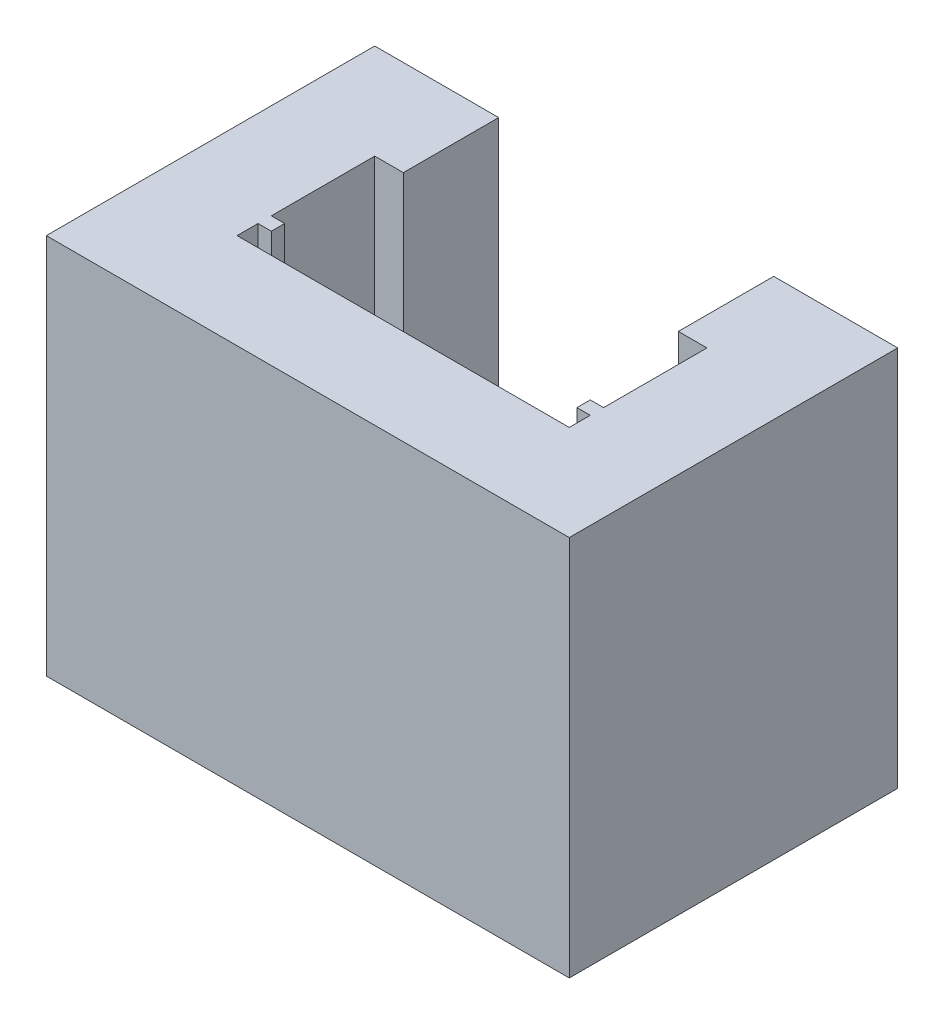
ISO-10303-21;
HEADER;
FILE_DESCRIPTION(('STEP AP214'),'2;1');
FILE_NAME('part.step','',(''),(''),'','','');
FILE_SCHEMA(('AUTOMOTIVE_DESIGN { 1 0 10303 214 1 1 1 1 }'));
ENDSEC;
DATA;
#1=APPLICATION_CONTEXT('core data for automotive mechanical design processes');
#2=APPLICATION_PROTOCOL_DEFINITION('international standard','automotive_design',2000,#1);
#3=PRODUCT_CONTEXT('',#1,'mechanical');
#4=PRODUCT('Part','Part','',(#3));
#5=PRODUCT_RELATED_PRODUCT_CATEGORY('part','',(#4));
#6=PRODUCT_DEFINITION_FORMATION('','',#4);
#7=PRODUCT_DEFINITION_CONTEXT('part definition',#1,'design');
#8=PRODUCT_DEFINITION('design','',#6,#7);
#9=PRODUCT_DEFINITION_SHAPE('','',#8);
#10=(LENGTH_UNIT() NAMED_UNIT(*) SI_UNIT(.MILLI.,.METRE.));
#11=(NAMED_UNIT(*) PLANE_ANGLE_UNIT() SI_UNIT($,.RADIAN.));
#12=(NAMED_UNIT(*) SI_UNIT($,.STERADIAN.) SOLID_ANGLE_UNIT());
#13=UNCERTAINTY_MEASURE_WITH_UNIT(LENGTH_MEASURE(1.E-05),#10,'distance_accuracy_value','');
#14=(GEOMETRIC_REPRESENTATION_CONTEXT(3) GLOBAL_UNCERTAINTY_ASSIGNED_CONTEXT((#13)) GLOBAL_UNIT_ASSIGNED_CONTEXT((#10,
#11,#12)) REPRESENTATION_CONTEXT('',''));
#15=CARTESIAN_POINT('',(0.,0.,0.));
#16=DIRECTION('',(0.,0.,1.));
#17=DIRECTION('',(1.,0.,0.));
#18=AXIS2_PLACEMENT_3D('',#15,#16,#17);
#19=CARTESIAN_POINT('',(8.71,20.,0.));
#20=DIRECTION('',(1.,0.,0.));
#21=DIRECTION('',(0.,0.,-1.));
#22=AXIS2_PLACEMENT_3D('',#19,#20,#21);
#23=PLANE('',#22);
#24=DIRECTION('',(0.,0.,1.));
#25=VECTOR('',#24,1.);
#26=CARTESIAN_POINT('',(8.71,0.,0.));
#27=LINE('',#26,#25);
#28=CARTESIAN_POINT('',(8.71,0.,-1.1));
#29=VERTEX_POINT('',#28);
#30=CARTESIAN_POINT('',(8.71,0.,0.));
#31=VERTEX_POINT('',#30);
#32=EDGE_CURVE('E218',#29,#31,#27,.T.);
#33=ORIENTED_EDGE('',*,*,#32,.T.);
#34=DIRECTION('',(0.,-1.,0.));
#35=VECTOR('',#34,1.);
#36=CARTESIAN_POINT('',(8.71,20.,0.));
#37=LINE('',#36,#35);
#38=CARTESIAN_POINT('',(8.71,20.,0.));
#39=VERTEX_POINT('',#38);
#40=EDGE_CURVE('E11',#39,#31,#37,.T.);
#41=ORIENTED_EDGE('',*,*,#40,.F.);
#42=DIRECTION('',(0.,0.,1.));
#43=VECTOR('',#42,1.);
#44=CARTESIAN_POINT('',(8.71,20.,0.));
#45=LINE('',#44,#43);
#46=CARTESIAN_POINT('',(8.71,20.,-1.1));
#47=VERTEX_POINT('',#46);
#48=EDGE_CURVE('E276',#47,#39,#45,.T.);
#49=ORIENTED_EDGE('',*,*,#48,.F.);
#50=DIRECTION('',(0.,-1.,0.));
#51=VECTOR('',#50,1.);
#52=CARTESIAN_POINT('',(8.71,20.,-1.1));
#53=LINE('',#52,#51);
#54=EDGE_CURVE('E214',#47,#29,#53,.T.);
#55=ORIENTED_EDGE('',*,*,#54,.T.);
#56=EDGE_LOOP('',(#33,#41,#49,#55));
#57=FACE_BOUND('',#56,.T.);
#58=ADVANCED_FACE('F45',(#57),#23,.F.);
#59=CARTESIAN_POINT('',(-8.71,20.,0.));
#60=DIRECTION('',(0.,0.,1.));
#61=DIRECTION('',(1.,0.,0.));
#62=AXIS2_PLACEMENT_3D('',#59,#60,#61);
#63=PLANE('',#62);
#64=DIRECTION('',(-1.,0.,0.));
#65=VECTOR('',#64,1.);
#66=CARTESIAN_POINT('',(-8.71,0.,0.));
#67=LINE('',#66,#65);
#68=CARTESIAN_POINT('',(-8.71,0.,0.));
#69=VERTEX_POINT('',#68);
#70=EDGE_CURVE('E222',#31,#69,#67,.T.);
#71=ORIENTED_EDGE('',*,*,#70,.T.);
#72=DIRECTION('',(0.,-1.,0.));
#73=VECTOR('',#72,1.);
#74=CARTESIAN_POINT('',(-8.71,20.,0.));
#75=LINE('',#74,#73);
#76=CARTESIAN_POINT('',(-8.71,20.,0.));
#77=VERTEX_POINT('',#76);
#78=EDGE_CURVE('E54',#77,#69,#75,.T.);
#79=ORIENTED_EDGE('',*,*,#78,.F.);
#80=DIRECTION('',(-1.,0.,0.));
#81=VECTOR('',#80,1.);
#82=CARTESIAN_POINT('',(-8.71,20.,0.));
#83=LINE('',#82,#81);
#84=EDGE_CURVE('E141',#39,#77,#83,.T.);
#85=ORIENTED_EDGE('',*,*,#84,.F.);
#86=ORIENTED_EDGE('',*,*,#40,.T.);
#87=EDGE_LOOP('',(#71,#79,#85,#86));
#88=FACE_BOUND('',#87,.T.);
#89=ADVANCED_FACE('F426',(#88),#63,.F.);
#90=CARTESIAN_POINT('',(-8.71,20.,0.));
#91=DIRECTION('',(-1.,0.,0.));
#92=DIRECTION('',(0.,0.,1.));
#93=AXIS2_PLACEMENT_3D('',#90,#91,#92);
#94=PLANE('',#93);
#95=DIRECTION('',(0.,0.,-1.));
#96=VECTOR('',#95,1.);
#97=CARTESIAN_POINT('',(-8.71,0.,0.));
#98=LINE('',#97,#96);
#99=CARTESIAN_POINT('',(-8.71,0.,-1.1));
#100=VERTEX_POINT('',#99);
#101=EDGE_CURVE('E225',#69,#100,#98,.T.);
#102=ORIENTED_EDGE('',*,*,#101,.T.);
#103=DIRECTION('',(0.,-1.,0.));
#104=VECTOR('',#103,1.);
#105=CARTESIAN_POINT('',(-8.71,20.,-1.1));
#106=LINE('',#105,#104);
#107=CARTESIAN_POINT('',(-8.71,20.,-1.1));
#108=VERTEX_POINT('',#107);
#109=EDGE_CURVE('E335',#108,#100,#106,.T.);
#110=ORIENTED_EDGE('',*,*,#109,.F.);
#111=DIRECTION('',(0.,0.,-1.));
#112=VECTOR('',#111,1.);
#113=CARTESIAN_POINT('',(-8.71,20.,0.));
#114=LINE('',#113,#112);
#115=EDGE_CURVE('E345',#77,#108,#114,.T.);
#116=ORIENTED_EDGE('',*,*,#115,.F.);
#117=ORIENTED_EDGE('',*,*,#78,.T.);
#118=EDGE_LOOP('',(#102,#110,#116,#117));
#119=FACE_BOUND('',#118,.T.);
#120=ADVANCED_FACE('F343',(#119),#94,.F.);
#121=CARTESIAN_POINT('',(-8.71,20.,-1.1));
#122=DIRECTION('',(0.,0.,-1.));
#123=DIRECTION('',(-1.,0.,0.));
#124=AXIS2_PLACEMENT_3D('',#121,#122,#123);
#125=PLANE('',#124);
#126=DIRECTION('',(1.,0.,0.));
#127=VECTOR('',#126,1.);
#128=CARTESIAN_POINT('',(-8.71,0.,-1.1));
#129=LINE('',#128,#127);
#130=CARTESIAN_POINT('',(-8.01,0.,-1.1));
#131=VERTEX_POINT('',#130);
#132=EDGE_CURVE('E228',#100,#131,#129,.T.);
#133=ORIENTED_EDGE('',*,*,#132,.T.);
#134=DIRECTION('',(0.,-1.,0.));
#135=VECTOR('',#134,1.);
#136=CARTESIAN_POINT('',(-8.01,20.,-1.1));
#137=LINE('',#136,#135);
#138=CARTESIAN_POINT('',(-8.01,20.,-1.1));
#139=VERTEX_POINT('',#138);
#140=EDGE_CURVE('E331',#139,#131,#137,.T.);
#141=ORIENTED_EDGE('',*,*,#140,.F.);
#142=DIRECTION('',(1.,0.,0.));
#143=VECTOR('',#142,1.);
#144=CARTESIAN_POINT('',(-8.71,20.,-1.1));
#145=LINE('',#144,#143);
#146=EDGE_CURVE('E364',#108,#139,#145,.T.);
#147=ORIENTED_EDGE('',*,*,#146,.F.);
#148=ORIENTED_EDGE('',*,*,#109,.T.);
#149=EDGE_LOOP('',(#133,#141,#147,#148));
#150=FACE_BOUND('',#149,.T.);
#151=ADVANCED_FACE('F354',(#150),#125,.F.);
#152=CARTESIAN_POINT('',(-8.01,20.,-1.1));
#153=DIRECTION('',(-1.,0.,0.));
#154=DIRECTION('',(0.,0.,1.));
#155=AXIS2_PLACEMENT_3D('',#152,#153,#154);
#156=PLANE('',#155);
#157=DIRECTION('',(0.,0.,-1.));
#158=VECTOR('',#157,1.);
#159=CARTESIAN_POINT('',(-8.01,0.,-1.1));
#160=LINE('',#159,#158);
#161=CARTESIAN_POINT('',(-8.01,0.,-1.8));
#162=VERTEX_POINT('',#161);
#163=EDGE_CURVE('E231',#131,#162,#160,.T.);
#164=ORIENTED_EDGE('',*,*,#163,.T.);
#165=DIRECTION('',(0.,-1.,0.));
#166=VECTOR('',#165,1.);
#167=CARTESIAN_POINT('',(-8.01,20.,-1.8));
#168=LINE('',#167,#166);
#169=CARTESIAN_POINT('',(-8.01,20.,-1.8));
#170=VERTEX_POINT('',#169);
#171=EDGE_CURVE('E327',#170,#162,#168,.T.);
#172=ORIENTED_EDGE('',*,*,#171,.F.);
#173=DIRECTION('',(0.,0.,-1.));
#174=VECTOR('',#173,1.);
#175=CARTESIAN_POINT('',(-8.01,20.,-1.1));
#176=LINE('',#175,#174);
#177=EDGE_CURVE('E360',#139,#170,#176,.T.);
#178=ORIENTED_EDGE('',*,*,#177,.F.);
#179=ORIENTED_EDGE('',*,*,#140,.T.);
#180=EDGE_LOOP('',(#164,#172,#178,#179));
#181=FACE_BOUND('',#180,.T.);
#182=ADVANCED_FACE('F358',(#181),#156,.F.);
#183=CARTESIAN_POINT('',(-8.01,20.,-1.8));
#184=DIRECTION('',(0.,0.,1.));
#185=DIRECTION('',(1.,0.,0.));
#186=AXIS2_PLACEMENT_3D('',#183,#184,#185);
#187=PLANE('',#186);
#188=DIRECTION('',(-1.,0.,0.));
#189=VECTOR('',#188,1.);
#190=CARTESIAN_POINT('',(-8.01,0.,-1.8));
#191=LINE('',#190,#189);
#192=CARTESIAN_POINT('',(-8.71,0.,-1.8));
#193=VERTEX_POINT('',#192);
#194=EDGE_CURVE('E234',#162,#193,#191,.T.);
#195=ORIENTED_EDGE('',*,*,#194,.T.);
#196=DIRECTION('',(0.,-1.,0.));
#197=VECTOR('',#196,1.);
#198=CARTESIAN_POINT('',(-8.71,20.,-1.8));
#199=LINE('',#198,#197);
#200=CARTESIAN_POINT('',(-8.71,20.,-1.8));
#201=VERTEX_POINT('',#200);
#202=EDGE_CURVE('E323',#201,#193,#199,.T.);
#203=ORIENTED_EDGE('',*,*,#202,.F.);
#204=DIRECTION('',(-1.,0.,0.));
#205=VECTOR('',#204,1.);
#206=CARTESIAN_POINT('',(-8.01,20.,-1.8));
#207=LINE('',#206,#205);
#208=EDGE_CURVE('E363',#170,#201,#207,.T.);
#209=ORIENTED_EDGE('',*,*,#208,.F.);
#210=ORIENTED_EDGE('',*,*,#171,.T.);
#211=EDGE_LOOP('',(#195,#203,#209,#210));
#212=FACE_BOUND('',#211,.T.);
#213=ADVANCED_FACE('F439',(#212),#187,.F.);
#214=CARTESIAN_POINT('',(-8.71,20.,-1.8));
#215=DIRECTION('',(-1.,0.,0.));
#216=DIRECTION('',(0.,0.,1.));
#217=AXIS2_PLACEMENT_3D('',#214,#215,#216);
#218=PLANE('',#217);
#219=DIRECTION('',(0.,0.,-1.));
#220=VECTOR('',#219,1.);
#221=CARTESIAN_POINT('',(-8.71,0.,-1.8));
#222=LINE('',#221,#220);
#223=CARTESIAN_POINT('',(-8.71,0.,-7.22));
#224=VERTEX_POINT('',#223);
#225=EDGE_CURVE('E237',#193,#224,#222,.T.);
#226=ORIENTED_EDGE('',*,*,#225,.T.);
#227=DIRECTION('',(0.,-1.,0.));
#228=VECTOR('',#227,1.);
#229=CARTESIAN_POINT('',(-8.71,20.,-7.22));
#230=LINE('',#229,#228);
#231=CARTESIAN_POINT('',(-8.71,20.,-7.22));
#232=VERTEX_POINT('',#231);
#233=EDGE_CURVE('E319',#232,#224,#230,.T.);
#234=ORIENTED_EDGE('',*,*,#233,.F.);
#235=DIRECTION('',(0.,0.,-1.));
#236=VECTOR('',#235,1.);
#237=CARTESIAN_POINT('',(-8.71,20.,-1.8));
#238=LINE('',#237,#236);
#239=EDGE_CURVE('E368',#201,#232,#238,.T.);
#240=ORIENTED_EDGE('',*,*,#239,.F.);
#241=ORIENTED_EDGE('',*,*,#202,.T.);
#242=EDGE_LOOP('',(#226,#234,#240,#241));
#243=FACE_BOUND('',#242,.T.);
#244=ADVANCED_FACE('F442',(#243),#218,.F.);
#245=CARTESIAN_POINT('',(-8.71,20.,-7.22));
#246=DIRECTION('',(0.,0.,-1.));
#247=DIRECTION('',(-1.,0.,0.));
#248=AXIS2_PLACEMENT_3D('',#245,#246,#247);
#249=PLANE('',#248);
#250=DIRECTION('',(1.,0.,0.));
#251=VECTOR('',#250,1.);
#252=CARTESIAN_POINT('',(-8.71,0.,-7.22));
#253=LINE('',#252,#251);
#254=CARTESIAN_POINT('',(-7.21,0.,-7.22));
#255=VERTEX_POINT('',#254);
#256=EDGE_CURVE('E240',#224,#255,#253,.T.);
#257=ORIENTED_EDGE('',*,*,#256,.T.);
#258=DIRECTION('',(0.,-1.,0.));
#259=VECTOR('',#258,1.);
#260=CARTESIAN_POINT('',(-7.21,20.,-7.22));
#261=LINE('',#260,#259);
#262=CARTESIAN_POINT('',(-7.21,20.,-7.22));
#263=VERTEX_POINT('',#262);
#264=EDGE_CURVE('E315',#263,#255,#261,.T.);
#265=ORIENTED_EDGE('',*,*,#264,.F.);
#266=DIRECTION('',(1.,0.,0.));
#267=VECTOR('',#266,1.);
#268=CARTESIAN_POINT('',(-8.71,20.,-7.22));
#269=LINE('',#268,#267);
#270=EDGE_CURVE('E375',#232,#263,#269,.T.);
#271=ORIENTED_EDGE('',*,*,#270,.F.);
#272=ORIENTED_EDGE('',*,*,#233,.T.);
#273=EDGE_LOOP('',(#257,#265,#271,#272));
#274=FACE_BOUND('',#273,.T.);
#275=ADVANCED_FACE('F446',(#274),#249,.F.);
#276=CARTESIAN_POINT('',(-7.21,20.,-7.22));
#277=DIRECTION('',(-1.,0.,0.));
#278=DIRECTION('',(0.,0.,1.));
#279=AXIS2_PLACEMENT_3D('',#276,#277,#278);
#280=PLANE('',#279);
#281=DIRECTION('',(0.,0.,-1.));
#282=VECTOR('',#281,1.);
#283=CARTESIAN_POINT('',(-7.21,0.,-7.22));
#284=LINE('',#283,#282);
#285=CARTESIAN_POINT('',(-7.21,0.,-12.22));
#286=VERTEX_POINT('',#285);
#287=EDGE_CURVE('E243',#255,#286,#284,.T.);
#288=ORIENTED_EDGE('',*,*,#287,.T.);
#289=DIRECTION('',(0.,-1.,0.));
#290=VECTOR('',#289,1.);
#291=CARTESIAN_POINT('',(-7.21,20.,-12.22));
#292=LINE('',#291,#290);
#293=CARTESIAN_POINT('',(-7.21,20.,-12.22));
#294=VERTEX_POINT('',#293);
#295=EDGE_CURVE('E311',#294,#286,#292,.T.);
#296=ORIENTED_EDGE('',*,*,#295,.F.);
#297=DIRECTION('',(0.,0.,-1.));
#298=VECTOR('',#297,1.);
#299=CARTESIAN_POINT('',(-7.21,20.,-7.22));
#300=LINE('',#299,#298);
#301=EDGE_CURVE('E378',#263,#294,#300,.T.);
#302=ORIENTED_EDGE('',*,*,#301,.F.);
#303=ORIENTED_EDGE('',*,*,#264,.T.);
#304=EDGE_LOOP('',(#288,#296,#302,#303));
#305=FACE_BOUND('',#304,.T.);
#306=ADVANCED_FACE('F450',(#305),#280,.F.);
#307=CARTESIAN_POINT('',(-13.71,20.,-12.22));
#308=DIRECTION('',(0.,0.,1.));
#309=DIRECTION('',(1.,0.,0.));
#310=AXIS2_PLACEMENT_3D('',#307,#308,#309);
#311=PLANE('',#310);
#312=DIRECTION('',(-1.,0.,0.));
#313=VECTOR('',#312,1.);
#314=CARTESIAN_POINT('',(-13.71,0.,-12.22));
#315=LINE('',#314,#313);
#316=CARTESIAN_POINT('',(-13.71,0.,-12.22));
#317=VERTEX_POINT('',#316);
#318=EDGE_CURVE('E246',#286,#317,#315,.T.);
#319=ORIENTED_EDGE('',*,*,#318,.T.);
#320=DIRECTION('',(0.,-1.,0.));
#321=VECTOR('',#320,1.);
#322=CARTESIAN_POINT('',(-13.71,20.,-12.22));
#323=LINE('',#322,#321);
#324=CARTESIAN_POINT('',(-13.71,20.,-12.22));
#325=VERTEX_POINT('',#324);
#326=EDGE_CURVE('E307',#325,#317,#323,.T.);
#327=ORIENTED_EDGE('',*,*,#326,.F.);
#328=DIRECTION('',(-1.,0.,0.));
#329=VECTOR('',#328,1.);
#330=CARTESIAN_POINT('',(-13.71,20.,-12.22));
#331=LINE('',#330,#329);
#332=EDGE_CURVE('E381',#294,#325,#331,.T.);
#333=ORIENTED_EDGE('',*,*,#332,.F.);
#334=ORIENTED_EDGE('',*,*,#295,.T.);
#335=EDGE_LOOP('',(#319,#327,#333,#334));
#336=FACE_BOUND('',#335,.T.);
#337=ADVANCED_FACE('F454',(#336),#311,.F.);
#338=CARTESIAN_POINT('',(-13.71,20.,5.));
#339=DIRECTION('',(1.,0.,0.));
#340=DIRECTION('',(0.,0.,-1.));
#341=AXIS2_PLACEMENT_3D('',#338,#339,#340);
#342=PLANE('',#341);
#343=DIRECTION('',(0.,0.,1.));
#344=VECTOR('',#343,1.);
#345=CARTESIAN_POINT('',(-13.71,0.,5.));
#346=LINE('',#345,#344);
#347=CARTESIAN_POINT('',(-13.71,0.,5.));
#348=VERTEX_POINT('',#347);
#349=EDGE_CURVE('E249',#317,#348,#346,.T.);
#350=ORIENTED_EDGE('',*,*,#349,.T.);
#351=DIRECTION('',(0.,-1.,0.));
#352=VECTOR('',#351,1.);
#353=CARTESIAN_POINT('',(-13.71,20.,5.));
#354=LINE('',#353,#352);
#355=CARTESIAN_POINT('',(-13.71,20.,5.));
#356=VERTEX_POINT('',#355);
#357=EDGE_CURVE('E303',#356,#348,#354,.T.);
#358=ORIENTED_EDGE('',*,*,#357,.F.);
#359=DIRECTION('',(0.,0.,1.));
#360=VECTOR('',#359,1.);
#361=CARTESIAN_POINT('',(-13.71,20.,5.));
#362=LINE('',#361,#360);
#363=EDGE_CURVE('E384',#325,#356,#362,.T.);
#364=ORIENTED_EDGE('',*,*,#363,.F.);
#365=ORIENTED_EDGE('',*,*,#326,.T.);
#366=EDGE_LOOP('',(#350,#358,#364,#365));
#367=FACE_BOUND('',#366,.T.);
#368=ADVANCED_FACE('F458',(#367),#342,.F.);
#369=CARTESIAN_POINT('',(-13.71,20.,5.));
#370=DIRECTION('',(0.,0.,-1.));
#371=DIRECTION('',(-1.,0.,0.));
#372=AXIS2_PLACEMENT_3D('',#369,#370,#371);
#373=PLANE('',#372);
#374=DIRECTION('',(1.,0.,0.));
#375=VECTOR('',#374,1.);
#376=CARTESIAN_POINT('',(-13.71,0.,5.));
#377=LINE('',#376,#375);
#378=CARTESIAN_POINT('',(13.71,0.,5.));
#379=VERTEX_POINT('',#378);
#380=EDGE_CURVE('E252',#348,#379,#377,.T.);
#381=ORIENTED_EDGE('',*,*,#380,.T.);
#382=DIRECTION('',(0.,-1.,0.));
#383=VECTOR('',#382,1.);
#384=CARTESIAN_POINT('',(13.71,20.,5.));
#385=LINE('',#384,#383);
#386=CARTESIAN_POINT('',(13.71,20.,5.));
#387=VERTEX_POINT('',#386);
#388=EDGE_CURVE('E299',#387,#379,#385,.T.);
#389=ORIENTED_EDGE('',*,*,#388,.F.);
#390=DIRECTION('',(1.,0.,0.));
#391=VECTOR('',#390,1.);
#392=CARTESIAN_POINT('',(-13.71,20.,5.));
#393=LINE('',#392,#391);
#394=EDGE_CURVE('E387',#356,#387,#393,.T.);
#395=ORIENTED_EDGE('',*,*,#394,.F.);
#396=ORIENTED_EDGE('',*,*,#357,.T.);
#397=EDGE_LOOP('',(#381,#389,#395,#396));
#398=FACE_BOUND('',#397,.T.);
#399=ADVANCED_FACE('F462',(#398),#373,.F.);
#400=CARTESIAN_POINT('',(13.71,20.,5.));
#401=DIRECTION('',(-1.,0.,0.));
#402=DIRECTION('',(0.,0.,1.));
#403=AXIS2_PLACEMENT_3D('',#400,#401,#402);
#404=PLANE('',#403);
#405=DIRECTION('',(0.,0.,-1.));
#406=VECTOR('',#405,1.);
#407=CARTESIAN_POINT('',(13.71,0.,5.));
#408=LINE('',#407,#406);
#409=CARTESIAN_POINT('',(13.71,0.,-12.22));
#410=VERTEX_POINT('',#409);
#411=EDGE_CURVE('E255',#379,#410,#408,.T.);
#412=ORIENTED_EDGE('',*,*,#411,.T.);
#413=DIRECTION('',(0.,-1.,0.));
#414=VECTOR('',#413,1.);
#415=CARTESIAN_POINT('',(13.71,20.,-12.22));
#416=LINE('',#415,#414);
#417=CARTESIAN_POINT('',(13.71,20.,-12.22));
#418=VERTEX_POINT('',#417);
#419=EDGE_CURVE('E295',#418,#410,#416,.T.);
#420=ORIENTED_EDGE('',*,*,#419,.F.);
#421=DIRECTION('',(0.,0.,-1.));
#422=VECTOR('',#421,1.);
#423=CARTESIAN_POINT('',(13.71,20.,5.));
#424=LINE('',#423,#422);
#425=EDGE_CURVE('E390',#387,#418,#424,.T.);
#426=ORIENTED_EDGE('',*,*,#425,.F.);
#427=ORIENTED_EDGE('',*,*,#388,.T.);
#428=EDGE_LOOP('',(#412,#420,#426,#427));
#429=FACE_BOUND('',#428,.T.);
#430=ADVANCED_FACE('F466',(#429),#404,.F.);
#431=CARTESIAN_POINT('',(13.71,20.,-12.22));
#432=DIRECTION('',(0.,0.,1.));
#433=DIRECTION('',(1.,0.,0.));
#434=AXIS2_PLACEMENT_3D('',#431,#432,#433);
#435=PLANE('',#434);
#436=DIRECTION('',(-1.,0.,0.));
#437=VECTOR('',#436,1.);
#438=CARTESIAN_POINT('',(13.71,0.,-12.22));
#439=LINE('',#438,#437);
#440=CARTESIAN_POINT('',(7.21,0.,-12.22));
#441=VERTEX_POINT('',#440);
#442=EDGE_CURVE('E258',#410,#441,#439,.T.);
#443=ORIENTED_EDGE('',*,*,#442,.T.);
#444=DIRECTION('',(0.,-1.,0.));
#445=VECTOR('',#444,1.);
#446=CARTESIAN_POINT('',(7.21,20.,-12.22));
#447=LINE('',#446,#445);
#448=CARTESIAN_POINT('',(7.21,20.,-12.22));
#449=VERTEX_POINT('',#448);
#450=EDGE_CURVE('E291',#449,#441,#447,.T.);
#451=ORIENTED_EDGE('',*,*,#450,.F.);
#452=DIRECTION('',(-1.,0.,0.));
#453=VECTOR('',#452,1.);
#454=CARTESIAN_POINT('',(13.71,20.,-12.22));
#455=LINE('',#454,#453);
#456=EDGE_CURVE('E393',#418,#449,#455,.T.);
#457=ORIENTED_EDGE('',*,*,#456,.F.);
#458=ORIENTED_EDGE('',*,*,#419,.T.);
#459=EDGE_LOOP('',(#443,#451,#457,#458));
#460=FACE_BOUND('',#459,.T.);
#461=ADVANCED_FACE('F470',(#460),#435,.F.);
#462=CARTESIAN_POINT('',(7.21,20.,-12.22));
#463=DIRECTION('',(1.,0.,0.));
#464=DIRECTION('',(0.,0.,-1.));
#465=AXIS2_PLACEMENT_3D('',#462,#463,#464);
#466=PLANE('',#465);
#467=DIRECTION('',(0.,0.,1.));
#468=VECTOR('',#467,1.);
#469=CARTESIAN_POINT('',(7.21,0.,-12.22));
#470=LINE('',#469,#468);
#471=CARTESIAN_POINT('',(7.21,0.,-7.22));
#472=VERTEX_POINT('',#471);
#473=EDGE_CURVE('E261',#441,#472,#470,.T.);
#474=ORIENTED_EDGE('',*,*,#473,.T.);
#475=DIRECTION('',(0.,-1.,0.));
#476=VECTOR('',#475,1.);
#477=CARTESIAN_POINT('',(7.21,20.,-7.22));
#478=LINE('',#477,#476);
#479=CARTESIAN_POINT('',(7.21,20.,-7.22));
#480=VERTEX_POINT('',#479);
#481=EDGE_CURVE('E287',#480,#472,#478,.T.);
#482=ORIENTED_EDGE('',*,*,#481,.F.);
#483=DIRECTION('',(0.,0.,1.));
#484=VECTOR('',#483,1.);
#485=CARTESIAN_POINT('',(7.21,20.,-12.22));
#486=LINE('',#485,#484);
#487=EDGE_CURVE('E396',#449,#480,#486,.T.);
#488=ORIENTED_EDGE('',*,*,#487,.F.);
#489=ORIENTED_EDGE('',*,*,#450,.T.);
#490=EDGE_LOOP('',(#474,#482,#488,#489));
#491=FACE_BOUND('',#490,.T.);
#492=ADVANCED_FACE('F474',(#491),#466,.F.);
#493=CARTESIAN_POINT('',(8.71,20.,-7.22));
#494=DIRECTION('',(0.,0.,-1.));
#495=DIRECTION('',(-1.,0.,0.));
#496=AXIS2_PLACEMENT_3D('',#493,#494,#495);
#497=PLANE('',#496);
#498=DIRECTION('',(1.,0.,0.));
#499=VECTOR('',#498,1.);
#500=CARTESIAN_POINT('',(8.71,0.,-7.22));
#501=LINE('',#500,#499);
#502=CARTESIAN_POINT('',(8.71,0.,-7.22));
#503=VERTEX_POINT('',#502);
#504=EDGE_CURVE('E264',#472,#503,#501,.T.);
#505=ORIENTED_EDGE('',*,*,#504,.T.);
#506=DIRECTION('',(0.,-1.,0.));
#507=VECTOR('',#506,1.);
#508=CARTESIAN_POINT('',(8.71,20.,-7.22));
#509=LINE('',#508,#507);
#510=CARTESIAN_POINT('',(8.71,20.,-7.22));
#511=VERTEX_POINT('',#510);
#512=EDGE_CURVE('E283',#511,#503,#509,.T.);
#513=ORIENTED_EDGE('',*,*,#512,.F.);
#514=DIRECTION('',(1.,0.,0.));
#515=VECTOR('',#514,1.);
#516=CARTESIAN_POINT('',(8.71,20.,-7.22));
#517=LINE('',#516,#515);
#518=EDGE_CURVE('E399',#480,#511,#517,.T.);
#519=ORIENTED_EDGE('',*,*,#518,.F.);
#520=ORIENTED_EDGE('',*,*,#481,.T.);
#521=EDGE_LOOP('',(#505,#513,#519,#520));
#522=FACE_BOUND('',#521,.T.);
#523=ADVANCED_FACE('F407',(#522),#497,.F.);
#524=CARTESIAN_POINT('',(8.71,20.,-1.8));
#525=DIRECTION('',(1.,0.,0.));
#526=DIRECTION('',(0.,0.,-1.));
#527=AXIS2_PLACEMENT_3D('',#524,#525,#526);
#528=PLANE('',#527);
#529=DIRECTION('',(0.,0.,1.));
#530=VECTOR('',#529,1.);
#531=CARTESIAN_POINT('',(8.71,0.,-1.8));
#532=LINE('',#531,#530);
#533=CARTESIAN_POINT('',(8.71,0.,-1.8));
#534=VERTEX_POINT('',#533);
#535=EDGE_CURVE('E267',#503,#534,#532,.T.);
#536=ORIENTED_EDGE('',*,*,#535,.T.);
#537=DIRECTION('',(0.,-1.,0.));
#538=VECTOR('',#537,1.);
#539=CARTESIAN_POINT('',(8.71,20.,-1.8));
#540=LINE('',#539,#538);
#541=CARTESIAN_POINT('',(8.71,20.,-1.8));
#542=VERTEX_POINT('',#541);
#543=EDGE_CURVE('E207',#542,#534,#540,.T.);
#544=ORIENTED_EDGE('',*,*,#543,.F.);
#545=DIRECTION('',(0.,0.,1.));
#546=VECTOR('',#545,1.);
#547=CARTESIAN_POINT('',(8.71,20.,-1.8));
#548=LINE('',#547,#546);
#549=EDGE_CURVE('E196',#511,#542,#548,.T.);
#550=ORIENTED_EDGE('',*,*,#549,.F.);
#551=ORIENTED_EDGE('',*,*,#512,.T.);
#552=EDGE_LOOP('',(#536,#544,#550,#551));
#553=FACE_BOUND('',#552,.T.);
#554=ADVANCED_FACE('F411',(#553),#528,.F.);
#555=CARTESIAN_POINT('',(8.01,20.,-1.8));
#556=DIRECTION('',(0.,0.,1.));
#557=DIRECTION('',(1.,0.,0.));
#558=AXIS2_PLACEMENT_3D('',#555,#556,#557);
#559=PLANE('',#558);
#560=DIRECTION('',(-1.,0.,0.));
#561=VECTOR('',#560,1.);
#562=CARTESIAN_POINT('',(8.01,0.,-1.8));
#563=LINE('',#562,#561);
#564=CARTESIAN_POINT('',(8.01,0.,-1.8));
#565=VERTEX_POINT('',#564);
#566=EDGE_CURVE('E205',#534,#565,#563,.T.);
#567=ORIENTED_EDGE('',*,*,#566,.T.);
#568=DIRECTION('',(0.,-1.,0.));
#569=VECTOR('',#568,1.);
#570=CARTESIAN_POINT('',(8.01,20.,-1.8));
#571=LINE('',#570,#569);
#572=CARTESIAN_POINT('',(8.01,20.,-1.8));
#573=VERTEX_POINT('',#572);
#574=EDGE_CURVE('E202',#573,#565,#571,.T.);
#575=ORIENTED_EDGE('',*,*,#574,.F.);
#576=DIRECTION('',(-1.,0.,0.));
#577=VECTOR('',#576,1.);
#578=CARTESIAN_POINT('',(8.01,20.,-1.8));
#579=LINE('',#578,#577);
#580=EDGE_CURVE('E190',#542,#573,#579,.T.);
#581=ORIENTED_EDGE('',*,*,#580,.F.);
#582=ORIENTED_EDGE('',*,*,#543,.T.);
#583=EDGE_LOOP('',(#567,#575,#581,#582));
#584=FACE_BOUND('',#583,.T.);
#585=ADVANCED_FACE('F203',(#584),#559,.F.);
#586=CARTESIAN_POINT('',(8.01,20.,-1.1));
#587=DIRECTION('',(1.,0.,0.));
#588=DIRECTION('',(0.,0.,-1.));
#589=AXIS2_PLACEMENT_3D('',#586,#587,#588);
#590=PLANE('',#589);
#591=DIRECTION('',(0.,0.,1.));
#592=VECTOR('',#591,1.);
#593=CARTESIAN_POINT('',(8.01,0.,-1.1));
#594=LINE('',#593,#592);
#595=CARTESIAN_POINT('',(8.01,0.,-1.1));
#596=VERTEX_POINT('',#595);
#597=EDGE_CURVE('E127',#565,#596,#594,.T.);
#598=ORIENTED_EDGE('',*,*,#597,.T.);
#599=DIRECTION('',(0.,-1.,0.));
#600=VECTOR('',#599,1.);
#601=CARTESIAN_POINT('',(8.01,20.,-1.1));
#602=LINE('',#601,#600);
#603=CARTESIAN_POINT('',(8.01,20.,-1.1));
#604=VERTEX_POINT('',#603);
#605=EDGE_CURVE('E208',#604,#596,#602,.T.);
#606=ORIENTED_EDGE('',*,*,#605,.F.);
#607=DIRECTION('',(0.,0.,1.));
#608=VECTOR('',#607,1.);
#609=CARTESIAN_POINT('',(8.01,20.,-1.1));
#610=LINE('',#609,#608);
#611=EDGE_CURVE('E194',#573,#604,#610,.T.);
#612=ORIENTED_EDGE('',*,*,#611,.F.);
#613=ORIENTED_EDGE('',*,*,#574,.T.);
#614=EDGE_LOOP('',(#598,#606,#612,#613));
#615=FACE_BOUND('',#614,.T.);
#616=ADVANCED_FACE('F210',(#615),#590,.F.);
#617=CARTESIAN_POINT('',(8.71,20.,-1.1));
#618=DIRECTION('',(0.,0.,-1.));
#619=DIRECTION('',(-1.,0.,0.));
#620=AXIS2_PLACEMENT_3D('',#617,#618,#619);
#621=PLANE('',#620);
#622=DIRECTION('',(1.,0.,0.));
#623=VECTOR('',#622,1.);
#624=CARTESIAN_POINT('',(8.71,0.,-1.1));
#625=LINE('',#624,#623);
#626=EDGE_CURVE('E133',#596,#29,#625,.T.);
#627=ORIENTED_EDGE('',*,*,#626,.T.);
#628=ORIENTED_EDGE('',*,*,#54,.F.);
#629=DIRECTION('',(1.,0.,0.));
#630=VECTOR('',#629,1.);
#631=CARTESIAN_POINT('',(8.71,20.,-1.1));
#632=LINE('',#631,#630);
#633=EDGE_CURVE('E62',#604,#47,#632,.T.);
#634=ORIENTED_EDGE('',*,*,#633,.F.);
#635=ORIENTED_EDGE('',*,*,#605,.T.);
#636=EDGE_LOOP('',(#627,#628,#634,#635));
#637=FACE_BOUND('',#636,.T.);
#638=ADVANCED_FACE('F415',(#637),#621,.F.);
#639=CARTESIAN_POINT('',(0.,20.,0.));
#640=DIRECTION('',(0.,1.,0.));
#641=DIRECTION('',(0.,0.,1.));
#642=AXIS2_PLACEMENT_3D('',#639,#640,#641);
#643=PLANE('',#642);
#644=ORIENTED_EDGE('',*,*,#48,.T.);
#645=ORIENTED_EDGE('',*,*,#84,.T.);
#646=ORIENTED_EDGE('',*,*,#115,.T.);
#647=ORIENTED_EDGE('',*,*,#146,.T.);
#648=ORIENTED_EDGE('',*,*,#177,.T.);
#649=ORIENTED_EDGE('',*,*,#208,.T.);
#650=ORIENTED_EDGE('',*,*,#239,.T.);
#651=ORIENTED_EDGE('',*,*,#270,.T.);
#652=ORIENTED_EDGE('',*,*,#301,.T.);
#653=ORIENTED_EDGE('',*,*,#332,.T.);
#654=ORIENTED_EDGE('',*,*,#363,.T.);
#655=ORIENTED_EDGE('',*,*,#394,.T.);
#656=ORIENTED_EDGE('',*,*,#425,.T.);
#657=ORIENTED_EDGE('',*,*,#456,.T.);
#658=ORIENTED_EDGE('',*,*,#487,.T.);
#659=ORIENTED_EDGE('',*,*,#518,.T.);
#660=ORIENTED_EDGE('',*,*,#549,.T.);
#661=ORIENTED_EDGE('',*,*,#580,.T.);
#662=ORIENTED_EDGE('',*,*,#611,.T.);
#663=ORIENTED_EDGE('',*,*,#633,.T.);
#664=EDGE_LOOP('',(#644,#645,#646,#647,#648,#649,#650,#651,#652,#653,#654,#655,#656,#657,#658,
#659,#660,#661,#662,#663));
#665=FACE_BOUND('',#664,.T.);
#666=ADVANCED_FACE('F192',(#665),#643,.T.);
#667=CARTESIAN_POINT('',(0.,0.,0.));
#668=DIRECTION('',(0.,1.,0.));
#669=DIRECTION('',(0.,0.,1.));
#670=AXIS2_PLACEMENT_3D('',#667,#668,#669);
#671=PLANE('',#670);
#672=ORIENTED_EDGE('',*,*,#32,.F.);
#673=ORIENTED_EDGE('',*,*,#626,.F.);
#674=ORIENTED_EDGE('',*,*,#597,.F.);
#675=ORIENTED_EDGE('',*,*,#566,.F.);
#676=ORIENTED_EDGE('',*,*,#535,.F.);
#677=ORIENTED_EDGE('',*,*,#504,.F.);
#678=ORIENTED_EDGE('',*,*,#473,.F.);
#679=ORIENTED_EDGE('',*,*,#442,.F.);
#680=ORIENTED_EDGE('',*,*,#411,.F.);
#681=ORIENTED_EDGE('',*,*,#380,.F.);
#682=ORIENTED_EDGE('',*,*,#349,.F.);
#683=ORIENTED_EDGE('',*,*,#318,.F.);
#684=ORIENTED_EDGE('',*,*,#287,.F.);
#685=ORIENTED_EDGE('',*,*,#256,.F.);
#686=ORIENTED_EDGE('',*,*,#225,.F.);
#687=ORIENTED_EDGE('',*,*,#194,.F.);
#688=ORIENTED_EDGE('',*,*,#163,.F.);
#689=ORIENTED_EDGE('',*,*,#132,.F.);
#690=ORIENTED_EDGE('',*,*,#101,.F.);
#691=ORIENTED_EDGE('',*,*,#70,.F.);
#692=EDGE_LOOP('',(#672,#673,#674,#675,#676,#677,#678,#679,#680,#681,#682,#683,#684,#685,#686,
#687,#688,#689,#690,#691));
#693=FACE_BOUND('',#692,.T.);
#694=ADVANCED_FACE('F349',(#693),#671,.F.);
#695=CLOSED_SHELL('',(#58,#89,#120,#151,#182,#213,#244,#275,#306,#337,#368,#399,#430,#461,#492,
#523,#554,#585,#616,#638,#666,#694));
#696=MANIFOLD_SOLID_BREP('B2',#695);
#697=ADVANCED_BREP_SHAPE_REPRESENTATION('',(#18,#696),#14);
#698=SHAPE_DEFINITION_REPRESENTATION(#9,#697);
ENDSEC;
END-ISO-10303-21;
